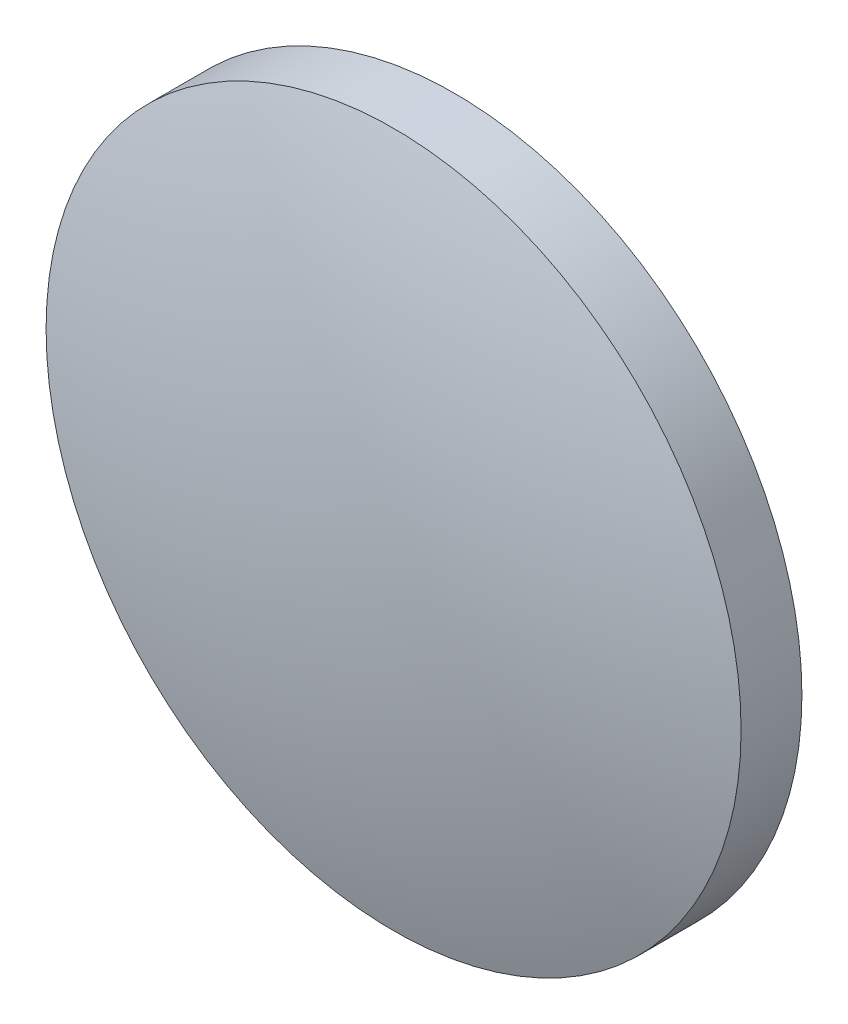
ISO-10303-21;
HEADER;
FILE_DESCRIPTION(('STEP AP214'),'2;1');
FILE_NAME('part.step','',(''),(''),'','','');
FILE_SCHEMA(('AUTOMOTIVE_DESIGN { 1 0 10303 214 1 1 1 1 }'));
ENDSEC;
DATA;
#1=APPLICATION_CONTEXT('core data for automotive mechanical design processes');
#2=APPLICATION_PROTOCOL_DEFINITION('international standard','automotive_design',2000,#1);
#3=PRODUCT_CONTEXT('',#1,'mechanical');
#4=PRODUCT('Part','Part','',(#3));
#5=PRODUCT_RELATED_PRODUCT_CATEGORY('part','',(#4));
#6=PRODUCT_DEFINITION_FORMATION('','',#4);
#7=PRODUCT_DEFINITION_CONTEXT('part definition',#1,'design');
#8=PRODUCT_DEFINITION('design','',#6,#7);
#9=PRODUCT_DEFINITION_SHAPE('','',#8);
#10=(LENGTH_UNIT() NAMED_UNIT(*) SI_UNIT(.MILLI.,.METRE.));
#11=(NAMED_UNIT(*) PLANE_ANGLE_UNIT() SI_UNIT($,.RADIAN.));
#12=(NAMED_UNIT(*) SI_UNIT($,.STERADIAN.) SOLID_ANGLE_UNIT());
#13=UNCERTAINTY_MEASURE_WITH_UNIT(LENGTH_MEASURE(1.E-05),#10,'distance_accuracy_value','');
#14=(GEOMETRIC_REPRESENTATION_CONTEXT(3) GLOBAL_UNCERTAINTY_ASSIGNED_CONTEXT((#13)) GLOBAL_UNIT_ASSIGNED_CONTEXT((#10,
#11,#12)) REPRESENTATION_CONTEXT('',''));
#15=CARTESIAN_POINT('',(0.,0.,0.));
#16=DIRECTION('',(0.,0.,1.));
#17=DIRECTION('',(1.,0.,0.));
#18=AXIS2_PLACEMENT_3D('',#15,#16,#17);
#19=CARTESIAN_POINT('',(0.,0.,-62.9923072370877));
#20=DIRECTION('',(0.,1.,0.));
#21=DIRECTION('',(0.,0.,1.));
#22=AXIS2_PLACEMENT_3D('',#19,#20,#21);
#23=SPHERICAL_SURFACE('',#22,68.);
#24=CARTESIAN_POINT('',(0.,0.,-62.9923072370877));
#25=DIRECTION('',(0.,0.,-1.));
#26=DIRECTION('',(-1.,0.,0.));
#27=AXIS2_PLACEMENT_3D('',#24,#25,#26);
#28=SPHERICAL_SURFACE('',#27,68.);
#29=CARTESIAN_POINT('',(0.,0.,2.00000000000002));
#30=DIRECTION('',(0.,0.,-1.));
#31=DIRECTION('',(-1.,0.,0.));
#32=AXIS2_PLACEMENT_3D('',#29,#30,#31);
#33=CIRCLE('',#32,20.);
#34=CARTESIAN_POINT('',(-20.,0.,2.00000000000002));
#35=VERTEX_POINT('',#34);
#36=EDGE_CURVE('E11',#35,#35,#33,.F.);
#37=ORIENTED_EDGE('',*,*,#36,.T.);
#38=EDGE_LOOP('',(#37));
#39=FACE_BOUND('',#38,.T.);
#40=ADVANCED_FACE('F78',(#39),#28,.T.);
#41=CARTESIAN_POINT('',(0.,0.,2.));
#42=DIRECTION('',(0.,0.,-1.));
#43=DIRECTION('',(-1.,0.,0.));
#44=AXIS2_PLACEMENT_3D('',#41,#42,#43);
#45=CYLINDRICAL_SURFACE('',#44,20.);
#46=ORIENTED_EDGE('',*,*,#36,.F.);
#47=EDGE_LOOP('',(#46));
#48=FACE_BOUND('',#47,.T.);
#49=CARTESIAN_POINT('',(0.,0.,-1.5));
#50=DIRECTION('',(0.,0.,-1.));
#51=DIRECTION('',(-1.,0.,0.));
#52=AXIS2_PLACEMENT_3D('',#49,#50,#51);
#53=CIRCLE('',#52,20.);
#54=CARTESIAN_POINT('',(-20.,0.,-1.5));
#55=VERTEX_POINT('',#54);
#56=EDGE_CURVE('E85',#55,#55,#53,.T.);
#57=ORIENTED_EDGE('',*,*,#56,.F.);
#58=EDGE_LOOP('',(#57));
#59=FACE_BOUND('',#58,.T.);
#60=ADVANCED_FACE('F80',(#48,#59),#45,.T.);
#61=CARTESIAN_POINT('',(0.,0.,-1.5));
#62=DIRECTION('',(0.,0.,-1.));
#63=DIRECTION('',(-1.,0.,0.));
#64=AXIS2_PLACEMENT_3D('',#61,#62,#63);
#65=PLANE('',#64);
#66=ORIENTED_EDGE('',*,*,#56,.T.);
#67=EDGE_LOOP('',(#66));
#68=FACE_BOUND('',#67,.T.);
#69=ADVANCED_FACE('F91',(#68),#65,.T.);
#70=CLOSED_SHELL('',(#40,#60,#69));
#71=MANIFOLD_SOLID_BREP('B2',#70);
#72=ADVANCED_BREP_SHAPE_REPRESENTATION('',(#18,#71),#14);
#73=SHAPE_DEFINITION_REPRESENTATION(#9,#72);
ENDSEC;
END-ISO-10303-21;
